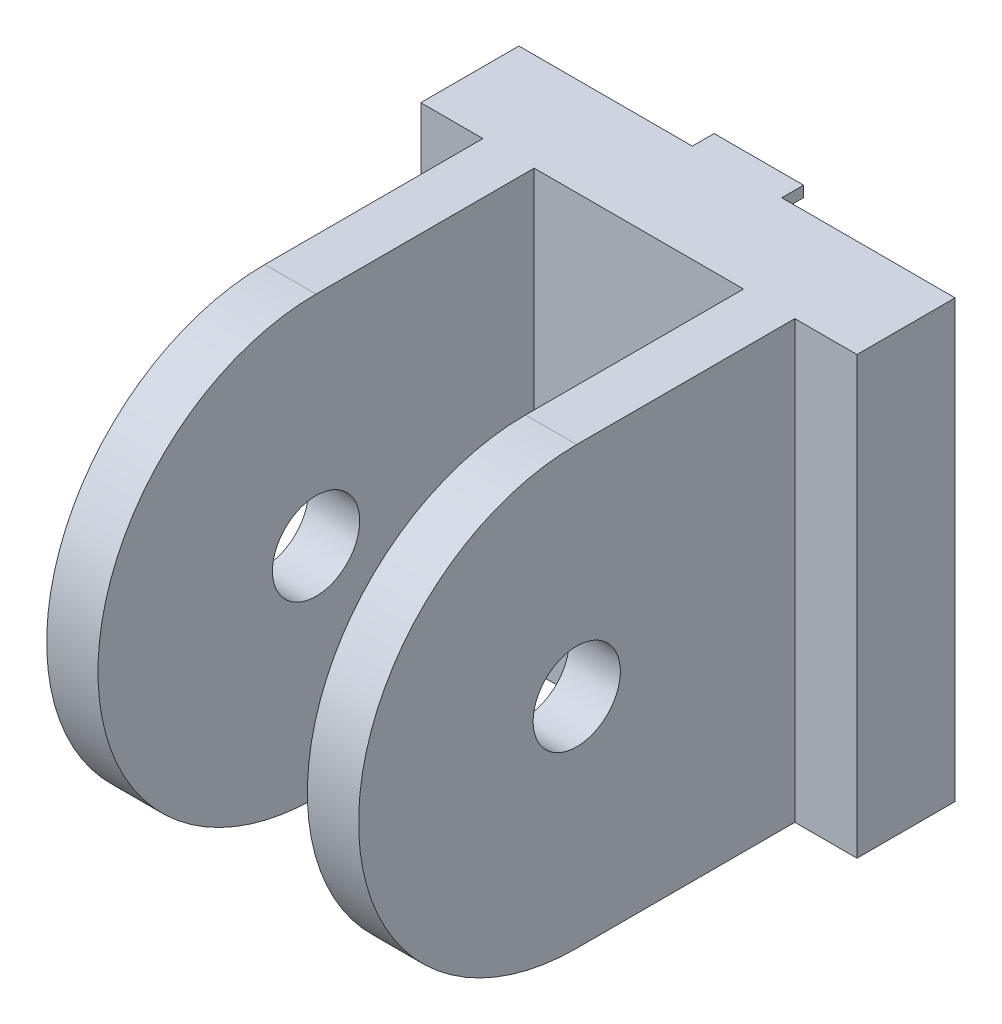
ISO-10303-21;
HEADER;
FILE_DESCRIPTION(('STEP AP214'),'2;1');
FILE_NAME('part.step','',(''),(''),'','','');
FILE_SCHEMA(('AUTOMOTIVE_DESIGN { 1 0 10303 214 1 1 1 1 }'));
ENDSEC;
DATA;
#1=APPLICATION_CONTEXT('core data for automotive mechanical design processes');
#2=APPLICATION_PROTOCOL_DEFINITION('international standard','automotive_design',2000,#1);
#3=PRODUCT_CONTEXT('',#1,'mechanical');
#4=PRODUCT('Part','Part','',(#3));
#5=PRODUCT_RELATED_PRODUCT_CATEGORY('part','',(#4));
#6=PRODUCT_DEFINITION_FORMATION('','',#4);
#7=PRODUCT_DEFINITION_CONTEXT('part definition',#1,'design');
#8=PRODUCT_DEFINITION('design','',#6,#7);
#9=PRODUCT_DEFINITION_SHAPE('','',#8);
#10=(LENGTH_UNIT() NAMED_UNIT(*) SI_UNIT(.MILLI.,.METRE.));
#11=(NAMED_UNIT(*) PLANE_ANGLE_UNIT() SI_UNIT($,.RADIAN.));
#12=(NAMED_UNIT(*) SI_UNIT($,.STERADIAN.) SOLID_ANGLE_UNIT());
#13=UNCERTAINTY_MEASURE_WITH_UNIT(LENGTH_MEASURE(1.E-05),#10,'distance_accuracy_value','');
#14=(GEOMETRIC_REPRESENTATION_CONTEXT(3) GLOBAL_UNCERTAINTY_ASSIGNED_CONTEXT((#13)) GLOBAL_UNIT_ASSIGNED_CONTEXT((#10,
#11,#12)) REPRESENTATION_CONTEXT('',''));
#15=CARTESIAN_POINT('',(0.,0.,0.));
#16=DIRECTION('',(0.,0.,1.));
#17=DIRECTION('',(1.,0.,0.));
#18=AXIS2_PLACEMENT_3D('',#15,#16,#17);
#19=CARTESIAN_POINT('',(20.,20.,0.));
#20=DIRECTION('',(0.,0.,-1.));
#21=DIRECTION('',(-1.,0.,0.));
#22=AXIS2_PLACEMENT_3D('',#19,#20,#21);
#23=PLANE('',#22);
#24=CARTESIAN_POINT('',(0.,0.,0.));
#25=DIRECTION('',(0.,0.,1.));
#26=DIRECTION('',(1.,0.,0.));
#27=AXIS2_PLACEMENT_3D('',#24,#25,#26);
#28=CIRCLE('',#27,4.);
#29=CARTESIAN_POINT('',(4.,0.,0.));
#30=VERTEX_POINT('',#29);
#31=EDGE_CURVE('E317',#30,#30,#28,.T.);
#32=ORIENTED_EDGE('',*,*,#31,.T.);
#33=EDGE_LOOP('',(#32));
#34=FACE_BOUND('',#33,.T.);
#35=DIRECTION('',(1.,0.,0.));
#36=VECTOR('',#35,1.);
#37=CARTESIAN_POINT('',(4.1,-19.,0.));
#38=LINE('',#37,#36);
#39=CARTESIAN_POINT('',(-4.1,-19.,0.));
#40=VERTEX_POINT('',#39);
#41=CARTESIAN_POINT('',(4.1,-19.,0.));
#42=VERTEX_POINT('',#41);
#43=EDGE_CURVE('E430',#40,#42,#38,.T.);
#44=ORIENTED_EDGE('',*,*,#43,.F.);
#45=DIRECTION('',(0.,1.,0.));
#46=VECTOR('',#45,1.);
#47=CARTESIAN_POINT('',(-4.1,-20.,0.));
#48=LINE('',#47,#46);
#49=CARTESIAN_POINT('',(-4.1,-20.,0.));
#50=VERTEX_POINT('',#49);
#51=EDGE_CURVE('E428',#50,#40,#48,.T.);
#52=ORIENTED_EDGE('',*,*,#51,.F.);
#53=DIRECTION('',(1.,0.,0.));
#54=VECTOR('',#53,1.);
#55=CARTESIAN_POINT('',(-20.,-20.,0.));
#56=LINE('',#55,#54);
#57=CARTESIAN_POINT('',(-20.,-20.,0.));
#58=VERTEX_POINT('',#57);
#59=EDGE_CURVE('E200',#58,#50,#56,.T.);
#60=ORIENTED_EDGE('',*,*,#59,.F.);
#61=DIRECTION('',(0.,-1.,0.));
#62=VECTOR('',#61,1.);
#63=CARTESIAN_POINT('',(-20.,-20.,0.));
#64=LINE('',#63,#62);
#65=CARTESIAN_POINT('',(-20.,20.,0.));
#66=VERTEX_POINT('',#65);
#67=EDGE_CURVE('E253',#66,#58,#64,.T.);
#68=ORIENTED_EDGE('',*,*,#67,.F.);
#69=DIRECTION('',(-1.,0.,0.));
#70=VECTOR('',#69,1.);
#71=CARTESIAN_POINT('',(-20.,20.,0.));
#72=LINE('',#71,#70);
#73=CARTESIAN_POINT('',(-4.1,20.,0.));
#74=VERTEX_POINT('',#73);
#75=EDGE_CURVE('E243',#74,#66,#72,.T.);
#76=ORIENTED_EDGE('',*,*,#75,.F.);
#77=DIRECTION('',(0.,1.,0.));
#78=VECTOR('',#77,1.);
#79=CARTESIAN_POINT('',(-4.1,20.,0.));
#80=LINE('',#79,#78);
#81=CARTESIAN_POINT('',(-4.1,19.,0.));
#82=VERTEX_POINT('',#81);
#83=EDGE_CURVE('E212',#82,#74,#80,.T.);
#84=ORIENTED_EDGE('',*,*,#83,.F.);
#85=DIRECTION('',(-1.,0.,0.));
#86=VECTOR('',#85,1.);
#87=CARTESIAN_POINT('',(4.1,19.,0.));
#88=LINE('',#87,#86);
#89=CARTESIAN_POINT('',(4.1,19.,0.));
#90=VERTEX_POINT('',#89);
#91=EDGE_CURVE('E60',#90,#82,#88,.T.);
#92=ORIENTED_EDGE('',*,*,#91,.F.);
#93=DIRECTION('',(0.,-1.,0.));
#94=VECTOR('',#93,1.);
#95=CARTESIAN_POINT('',(4.1,20.,0.));
#96=LINE('',#95,#94);
#97=CARTESIAN_POINT('',(4.1,20.,0.));
#98=VERTEX_POINT('',#97);
#99=EDGE_CURVE('E201',#98,#90,#96,.T.);
#100=ORIENTED_EDGE('',*,*,#99,.F.);
#101=CARTESIAN_POINT('',(20.,20.,0.));
#102=VERTEX_POINT('',#101);
#103=EDGE_CURVE('E246',#102,#98,#72,.T.);
#104=ORIENTED_EDGE('',*,*,#103,.F.);
#105=DIRECTION('',(0.,1.,0.));
#106=VECTOR('',#105,1.);
#107=CARTESIAN_POINT('',(20.,-20.,0.));
#108=LINE('',#107,#106);
#109=CARTESIAN_POINT('',(20.,-20.,0.));
#110=VERTEX_POINT('',#109);
#111=EDGE_CURVE('E247',#110,#102,#108,.T.);
#112=ORIENTED_EDGE('',*,*,#111,.F.);
#113=CARTESIAN_POINT('',(4.1,-20.,0.));
#114=VERTEX_POINT('',#113);
#115=EDGE_CURVE('E256',#114,#110,#56,.T.);
#116=ORIENTED_EDGE('',*,*,#115,.F.);
#117=DIRECTION('',(0.,-1.,0.));
#118=VECTOR('',#117,1.);
#119=CARTESIAN_POINT('',(4.1,-20.,0.));
#120=LINE('',#119,#118);
#121=EDGE_CURVE('E193',#42,#114,#120,.T.);
#122=ORIENTED_EDGE('',*,*,#121,.F.);
#123=EDGE_LOOP('',(#44,#52,#60,#68,#76,#84,#92,#100,#104,#112,#116,#122));
#124=FACE_BOUND('',#123,.T.);
#125=ADVANCED_FACE('F35',(#34,#124),#23,.T.);
#126=CARTESIAN_POINT('',(-20.,20.,9.));
#127=DIRECTION('',(0.,-1.,0.));
#128=DIRECTION('',(0.,0.,-1.));
#129=AXIS2_PLACEMENT_3D('',#126,#127,#128);
#130=PLANE('',#129);
#131=DIRECTION('',(1.,0.,0.));
#132=VECTOR('',#131,1.);
#133=CARTESIAN_POINT('',(-143.599890182419,20.,29.));
#134=LINE('',#133,#132);
#135=CARTESIAN_POINT('',(9.6,20.,29.));
#136=VERTEX_POINT('',#135);
#137=CARTESIAN_POINT('',(14.3,20.,29.));
#138=VERTEX_POINT('',#137);
#139=EDGE_CURVE('E329',#136,#138,#134,.T.);
#140=ORIENTED_EDGE('',*,*,#139,.T.);
#141=DIRECTION('',(0.,0.,-1.));
#142=VECTOR('',#141,1.);
#143=CARTESIAN_POINT('',(14.3,20.,49.));
#144=LINE('',#143,#142);
#145=CARTESIAN_POINT('',(14.3,20.,9.));
#146=VERTEX_POINT('',#145);
#147=EDGE_CURVE('E356',#138,#146,#144,.T.);
#148=ORIENTED_EDGE('',*,*,#147,.T.);
#149=DIRECTION('',(-1.,0.,0.));
#150=VECTOR('',#149,1.);
#151=CARTESIAN_POINT('',(-20.,20.,9.));
#152=LINE('',#151,#150);
#153=CARTESIAN_POINT('',(20.,20.,9.));
#154=VERTEX_POINT('',#153);
#155=EDGE_CURVE('E267',#154,#146,#152,.T.);
#156=ORIENTED_EDGE('',*,*,#155,.F.);
#157=DIRECTION('',(0.,0.,-1.));
#158=VECTOR('',#157,1.);
#159=CARTESIAN_POINT('',(20.,20.,9.));
#160=LINE('',#159,#158);
#161=EDGE_CURVE('E11',#154,#102,#160,.T.);
#162=ORIENTED_EDGE('',*,*,#161,.T.);
#163=ORIENTED_EDGE('',*,*,#103,.T.);
#164=DIRECTION('',(0.,0.,1.));
#165=VECTOR('',#164,1.);
#166=CARTESIAN_POINT('',(4.1,20.,-2.));
#167=LINE('',#166,#165);
#168=CARTESIAN_POINT('',(4.1,20.,-2.));
#169=VERTEX_POINT('',#168);
#170=EDGE_CURVE('E218',#169,#98,#167,.T.);
#171=ORIENTED_EDGE('',*,*,#170,.F.);
#172=DIRECTION('',(1.,0.,0.));
#173=VECTOR('',#172,1.);
#174=CARTESIAN_POINT('',(4.1,20.,-2.));
#175=LINE('',#174,#173);
#176=CARTESIAN_POINT('',(-4.1,20.,-2.));
#177=VERTEX_POINT('',#176);
#178=EDGE_CURVE('E216',#177,#169,#175,.T.);
#179=ORIENTED_EDGE('',*,*,#178,.F.);
#180=DIRECTION('',(0.,0.,1.));
#181=VECTOR('',#180,1.);
#182=CARTESIAN_POINT('',(-4.1,20.,-2.));
#183=LINE('',#182,#181);
#184=EDGE_CURVE('E229',#177,#74,#183,.T.);
#185=ORIENTED_EDGE('',*,*,#184,.T.);
#186=ORIENTED_EDGE('',*,*,#75,.T.);
#187=DIRECTION('',(0.,0.,-1.));
#188=VECTOR('',#187,1.);
#189=CARTESIAN_POINT('',(-20.,20.,9.));
#190=LINE('',#189,#188);
#191=CARTESIAN_POINT('',(-20.,20.,9.));
#192=VERTEX_POINT('',#191);
#193=EDGE_CURVE('E44',#192,#66,#190,.T.);
#194=ORIENTED_EDGE('',*,*,#193,.F.);
#195=CARTESIAN_POINT('',(-14.3,20.,9.));
#196=VERTEX_POINT('',#195);
#197=EDGE_CURVE('E273',#196,#192,#152,.T.);
#198=ORIENTED_EDGE('',*,*,#197,.F.);
#199=DIRECTION('',(0.,0.,-1.));
#200=VECTOR('',#199,1.);
#201=CARTESIAN_POINT('',(-14.3,20.,49.));
#202=LINE('',#201,#200);
#203=CARTESIAN_POINT('',(-14.3,20.,29.));
#204=VERTEX_POINT('',#203);
#205=EDGE_CURVE('E290',#204,#196,#202,.T.);
#206=ORIENTED_EDGE('',*,*,#205,.F.);
#207=CARTESIAN_POINT('',(-9.6,20.,29.));
#208=VERTEX_POINT('',#207);
#209=EDGE_CURVE('E332',#204,#208,#134,.T.);
#210=ORIENTED_EDGE('',*,*,#209,.T.);
#211=DIRECTION('',(0.,0.,-1.));
#212=VECTOR('',#211,1.);
#213=CARTESIAN_POINT('',(-9.59999999999999,20.,49.));
#214=LINE('',#213,#212);
#215=CARTESIAN_POINT('',(-9.59999999999999,20.,9.));
#216=VERTEX_POINT('',#215);
#217=EDGE_CURVE('E304',#208,#216,#214,.T.);
#218=ORIENTED_EDGE('',*,*,#217,.T.);
#219=CARTESIAN_POINT('',(9.59999999999999,20.,9.));
#220=VERTEX_POINT('',#219);
#221=EDGE_CURVE('E272',#220,#216,#152,.T.);
#222=ORIENTED_EDGE('',*,*,#221,.F.);
#223=DIRECTION('',(0.,0.,-1.));
#224=VECTOR('',#223,1.);
#225=CARTESIAN_POINT('',(9.59999999999999,20.,49.));
#226=LINE('',#225,#224);
#227=EDGE_CURVE('E354',#136,#220,#226,.T.);
#228=ORIENTED_EDGE('',*,*,#227,.F.);
#229=EDGE_LOOP('',(#140,#148,#156,#162,#163,#171,#179,#185,#186,#194,#198,#206,#210,#218,#222,#228));
#230=FACE_BOUND('',#229,.T.);
#231=ADVANCED_FACE('F376',(#230),#130,.F.);
#232=CARTESIAN_POINT('',(20.,20.,9.));
#233=DIRECTION('',(0.,0.,-1.));
#234=DIRECTION('',(-1.,0.,0.));
#235=AXIS2_PLACEMENT_3D('',#232,#233,#234);
#236=PLANE('',#235);
#237=DIRECTION('',(0.,1.,0.));
#238=VECTOR('',#237,1.);
#239=CARTESIAN_POINT('',(14.3,-20.,9.));
#240=LINE('',#239,#238);
#241=CARTESIAN_POINT('',(14.3,-20.,9.));
#242=VERTEX_POINT('',#241);
#243=EDGE_CURVE('E343',#242,#146,#240,.T.);
#244=ORIENTED_EDGE('',*,*,#243,.F.);
#245=DIRECTION('',(1.,0.,0.));
#246=VECTOR('',#245,1.);
#247=CARTESIAN_POINT('',(-20.,-20.,9.));
#248=LINE('',#247,#246);
#249=CARTESIAN_POINT('',(20.,-20.,9.));
#250=VERTEX_POINT('',#249);
#251=EDGE_CURVE('E285',#242,#250,#248,.T.);
#252=ORIENTED_EDGE('',*,*,#251,.T.);
#253=DIRECTION('',(0.,1.,0.));
#254=VECTOR('',#253,1.);
#255=CARTESIAN_POINT('',(20.,-20.,9.));
#256=LINE('',#255,#254);
#257=EDGE_CURVE('E258',#250,#154,#256,.T.);
#258=ORIENTED_EDGE('',*,*,#257,.T.);
#259=ORIENTED_EDGE('',*,*,#155,.T.);
#260=EDGE_LOOP('',(#244,#252,#258,#259));
#261=FACE_BOUND('',#260,.T.);
#262=ADVANCED_FACE('F384',(#261),#236,.F.);
#263=CARTESIAN_POINT('',(0.,0.,9.));
#264=DIRECTION('',(0.,0.,1.));
#265=DIRECTION('',(1.,0.,0.));
#266=AXIS2_PLACEMENT_3D('',#263,#264,#265);
#267=CIRCLE('',#266,4.);
#268=CARTESIAN_POINT('',(4.,0.,9.));
#269=VERTEX_POINT('',#268);
#270=EDGE_CURVE('E322',#269,#269,#267,.T.);
#271=ORIENTED_EDGE('',*,*,#270,.F.);
#272=EDGE_LOOP('',(#271));
#273=FACE_BOUND('',#272,.T.);
#274=DIRECTION('',(0.,-1.,0.));
#275=VECTOR('',#274,1.);
#276=CARTESIAN_POINT('',(9.59999999999999,-20.,9.));
#277=LINE('',#276,#275);
#278=CARTESIAN_POINT('',(9.59999999999999,-20.,9.));
#279=VERTEX_POINT('',#278);
#280=EDGE_CURVE('E347',#220,#279,#277,.T.);
#281=ORIENTED_EDGE('',*,*,#280,.F.);
#282=ORIENTED_EDGE('',*,*,#221,.T.);
#283=DIRECTION('',(0.,1.,0.));
#284=VECTOR('',#283,1.);
#285=CARTESIAN_POINT('',(-9.59999999999999,-20.,9.));
#286=LINE('',#285,#284);
#287=CARTESIAN_POINT('',(-9.59999999999999,-20.,9.));
#288=VERTEX_POINT('',#287);
#289=EDGE_CURVE('E302',#288,#216,#286,.T.);
#290=ORIENTED_EDGE('',*,*,#289,.F.);
#291=EDGE_CURVE('E409',#288,#279,#248,.T.);
#292=ORIENTED_EDGE('',*,*,#291,.T.);
#293=EDGE_LOOP('',(#281,#282,#290,#292));
#294=FACE_BOUND('',#293,.T.);
#295=ADVANCED_FACE('F401',(#273,#294),#236,.F.);
#296=DIRECTION('',(0.,-1.,0.));
#297=VECTOR('',#296,1.);
#298=CARTESIAN_POINT('',(-14.3,-20.,9.));
#299=LINE('',#298,#297);
#300=CARTESIAN_POINT('',(-14.3,-20.,9.));
#301=VERTEX_POINT('',#300);
#302=EDGE_CURVE('E296',#196,#301,#299,.T.);
#303=ORIENTED_EDGE('',*,*,#302,.F.);
#304=ORIENTED_EDGE('',*,*,#197,.T.);
#305=DIRECTION('',(0.,-1.,0.));
#306=VECTOR('',#305,1.);
#307=CARTESIAN_POINT('',(-20.,-20.,9.));
#308=LINE('',#307,#306);
#309=CARTESIAN_POINT('',(-20.,-20.,9.));
#310=VERTEX_POINT('',#309);
#311=EDGE_CURVE('E271',#192,#310,#308,.T.);
#312=ORIENTED_EDGE('',*,*,#311,.T.);
#313=EDGE_CURVE('E263',#310,#301,#248,.T.);
#314=ORIENTED_EDGE('',*,*,#313,.T.);
#315=EDGE_LOOP('',(#303,#304,#312,#314));
#316=FACE_BOUND('',#315,.T.);
#317=ADVANCED_FACE('F373',(#316),#236,.F.);
#318=CARTESIAN_POINT('',(20.,-20.,9.));
#319=DIRECTION('',(-1.,0.,0.));
#320=DIRECTION('',(0.,0.,1.));
#321=AXIS2_PLACEMENT_3D('',#318,#319,#320);
#322=PLANE('',#321);
#323=ORIENTED_EDGE('',*,*,#111,.T.);
#324=ORIENTED_EDGE('',*,*,#161,.F.);
#325=ORIENTED_EDGE('',*,*,#257,.F.);
#326=DIRECTION('',(0.,0.,-1.));
#327=VECTOR('',#326,1.);
#328=CARTESIAN_POINT('',(20.,-20.,9.));
#329=LINE('',#328,#327);
#330=EDGE_CURVE('E259',#250,#110,#329,.T.);
#331=ORIENTED_EDGE('',*,*,#330,.T.);
#332=EDGE_LOOP('',(#323,#324,#325,#331));
#333=FACE_BOUND('',#332,.T.);
#334=ADVANCED_FACE('F37',(#333),#322,.F.);
#335=CARTESIAN_POINT('',(-20.,-20.,9.));
#336=DIRECTION('',(1.,0.,0.));
#337=DIRECTION('',(0.,0.,-1.));
#338=AXIS2_PLACEMENT_3D('',#335,#336,#337);
#339=PLANE('',#338);
#340=ORIENTED_EDGE('',*,*,#67,.T.);
#341=DIRECTION('',(0.,0.,-1.));
#342=VECTOR('',#341,1.);
#343=CARTESIAN_POINT('',(-20.,-20.,9.));
#344=LINE('',#343,#342);
#345=EDGE_CURVE('E262',#310,#58,#344,.T.);
#346=ORIENTED_EDGE('',*,*,#345,.F.);
#347=ORIENTED_EDGE('',*,*,#311,.F.);
#348=ORIENTED_EDGE('',*,*,#193,.T.);
#349=EDGE_LOOP('',(#340,#346,#347,#348));
#350=FACE_BOUND('',#349,.T.);
#351=ADVANCED_FACE('F426',(#350),#339,.F.);
#352=CARTESIAN_POINT('',(-20.,-20.,9.));
#353=DIRECTION('',(0.,1.,0.));
#354=DIRECTION('',(0.,0.,1.));
#355=AXIS2_PLACEMENT_3D('',#352,#353,#354);
#356=PLANE('',#355);
#357=DIRECTION('',(0.,0.,-1.));
#358=VECTOR('',#357,1.);
#359=CARTESIAN_POINT('',(14.3,-20.,49.));
#360=LINE('',#359,#358);
#361=CARTESIAN_POINT('',(14.3,-20.,29.));
#362=VERTEX_POINT('',#361);
#363=EDGE_CURVE('E350',#362,#242,#360,.T.);
#364=ORIENTED_EDGE('',*,*,#363,.F.);
#365=DIRECTION('',(1.,0.,0.));
#366=VECTOR('',#365,1.);
#367=CARTESIAN_POINT('',(-143.599890182419,-20.,29.));
#368=LINE('',#367,#366);
#369=CARTESIAN_POINT('',(9.6,-20.,29.));
#370=VERTEX_POINT('',#369);
#371=EDGE_CURVE('E328',#370,#362,#368,.T.);
#372=ORIENTED_EDGE('',*,*,#371,.F.);
#373=DIRECTION('',(0.,0.,-1.));
#374=VECTOR('',#373,1.);
#375=CARTESIAN_POINT('',(9.59999999999999,-20.,49.));
#376=LINE('',#375,#374);
#377=EDGE_CURVE('E352',#370,#279,#376,.T.);
#378=ORIENTED_EDGE('',*,*,#377,.T.);
#379=ORIENTED_EDGE('',*,*,#291,.F.);
#380=DIRECTION('',(0.,0.,-1.));
#381=VECTOR('',#380,1.);
#382=CARTESIAN_POINT('',(-9.59999999999999,-20.,49.));
#383=LINE('',#382,#381);
#384=CARTESIAN_POINT('',(-9.6,-20.,29.));
#385=VERTEX_POINT('',#384);
#386=EDGE_CURVE('E291',#385,#288,#383,.T.);
#387=ORIENTED_EDGE('',*,*,#386,.F.);
#388=CARTESIAN_POINT('',(-14.3,-20.,29.));
#389=VERTEX_POINT('',#388);
#390=EDGE_CURVE('E333',#389,#385,#368,.T.);
#391=ORIENTED_EDGE('',*,*,#390,.F.);
#392=DIRECTION('',(0.,0.,-1.));
#393=VECTOR('',#392,1.);
#394=CARTESIAN_POINT('',(-14.3,-20.,49.));
#395=LINE('',#394,#393);
#396=EDGE_CURVE('E287',#389,#301,#395,.T.);
#397=ORIENTED_EDGE('',*,*,#396,.T.);
#398=ORIENTED_EDGE('',*,*,#313,.F.);
#399=ORIENTED_EDGE('',*,*,#345,.T.);
#400=ORIENTED_EDGE('',*,*,#59,.T.);
#401=DIRECTION('',(0.,0.,1.));
#402=VECTOR('',#401,1.);
#403=CARTESIAN_POINT('',(-4.1,-20.,-2.));
#404=LINE('',#403,#402);
#405=CARTESIAN_POINT('',(-4.1,-20.,-2.));
#406=VERTEX_POINT('',#405);
#407=EDGE_CURVE('E178',#406,#50,#404,.T.);
#408=ORIENTED_EDGE('',*,*,#407,.F.);
#409=DIRECTION('',(-1.,0.,0.));
#410=VECTOR('',#409,1.);
#411=CARTESIAN_POINT('',(4.1,-20.,-2.));
#412=LINE('',#411,#410);
#413=CARTESIAN_POINT('',(4.1,-20.,-2.));
#414=VERTEX_POINT('',#413);
#415=EDGE_CURVE('E185',#414,#406,#412,.T.);
#416=ORIENTED_EDGE('',*,*,#415,.F.);
#417=DIRECTION('',(0.,0.,1.));
#418=VECTOR('',#417,1.);
#419=CARTESIAN_POINT('',(4.1,-20.,-2.));
#420=LINE('',#419,#418);
#421=EDGE_CURVE('E437',#414,#114,#420,.T.);
#422=ORIENTED_EDGE('',*,*,#421,.T.);
#423=ORIENTED_EDGE('',*,*,#115,.T.);
#424=ORIENTED_EDGE('',*,*,#330,.F.);
#425=ORIENTED_EDGE('',*,*,#251,.F.);
#426=EDGE_LOOP('',(#364,#372,#378,#379,#387,#391,#397,#398,#399,#400,#408,#416,#422,#423,#424,#425));
#427=FACE_BOUND('',#426,.T.);
#428=ADVANCED_FACE('F197',(#427),#356,.F.);
#429=CARTESIAN_POINT('',(-9.59999999999999,-20.,49.));
#430=DIRECTION('',(-1.,0.,0.));
#431=DIRECTION('',(0.,0.,1.));
#432=AXIS2_PLACEMENT_3D('',#429,#430,#431);
#433=PLANE('',#432);
#434=CARTESIAN_POINT('',(-9.59999999999999,0.,29.));
#435=DIRECTION('',(-1.,0.,0.));
#436=DIRECTION('',(0.,0.,1.));
#437=AXIS2_PLACEMENT_3D('',#434,#435,#436);
#438=CIRCLE('',#437,4.);
#439=CARTESIAN_POINT('',(-9.59999999999999,0.,33.));
#440=VERTEX_POINT('',#439);
#441=EDGE_CURVE('E314',#440,#440,#438,.T.);
#442=ORIENTED_EDGE('',*,*,#441,.T.);
#443=EDGE_LOOP('',(#442));
#444=FACE_BOUND('',#443,.T.);
#445=CARTESIAN_POINT('',(-9.6,0.,29.));
#446=DIRECTION('',(-1.,0.,0.));
#447=DIRECTION('',(0.,0.,1.));
#448=AXIS2_PLACEMENT_3D('',#445,#446,#447);
#449=CIRCLE('',#448,20.);
#450=EDGE_CURVE('E338',#208,#385,#449,.F.);
#451=ORIENTED_EDGE('',*,*,#450,.T.);
#452=ORIENTED_EDGE('',*,*,#386,.T.);
#453=ORIENTED_EDGE('',*,*,#289,.T.);
#454=ORIENTED_EDGE('',*,*,#217,.F.);
#455=EDGE_LOOP('',(#451,#452,#453,#454));
#456=FACE_BOUND('',#455,.T.);
#457=ADVANCED_FACE('F414',(#444,#456),#433,.F.);
#458=CARTESIAN_POINT('',(-14.3,-20.,49.));
#459=DIRECTION('',(1.,0.,0.));
#460=DIRECTION('',(0.,0.,-1.));
#461=AXIS2_PLACEMENT_3D('',#458,#459,#460);
#462=PLANE('',#461);
#463=CARTESIAN_POINT('',(-14.3,0.,29.));
#464=DIRECTION('',(-1.,0.,0.));
#465=DIRECTION('',(0.,0.,1.));
#466=AXIS2_PLACEMENT_3D('',#463,#464,#465);
#467=CIRCLE('',#466,4.);
#468=CARTESIAN_POINT('',(-14.3,0.,33.));
#469=VERTEX_POINT('',#468);
#470=EDGE_CURVE('E310',#469,#469,#467,.T.);
#471=ORIENTED_EDGE('',*,*,#470,.F.);
#472=EDGE_LOOP('',(#471));
#473=FACE_BOUND('',#472,.T.);
#474=ORIENTED_EDGE('',*,*,#396,.F.);
#475=CARTESIAN_POINT('',(-14.3,0.,29.));
#476=DIRECTION('',(1.,0.,0.));
#477=DIRECTION('',(0.,0.,-1.));
#478=AXIS2_PLACEMENT_3D('',#475,#476,#477);
#479=CIRCLE('',#478,20.);
#480=EDGE_CURVE('E341',#389,#204,#479,.F.);
#481=ORIENTED_EDGE('',*,*,#480,.T.);
#482=ORIENTED_EDGE('',*,*,#205,.T.);
#483=ORIENTED_EDGE('',*,*,#302,.T.);
#484=EDGE_LOOP('',(#474,#481,#482,#483));
#485=FACE_BOUND('',#484,.T.);
#486=ADVANCED_FACE('F368',(#473,#485),#462,.F.);
#487=CARTESIAN_POINT('',(14.3,-20.,49.));
#488=DIRECTION('',(-1.,0.,0.));
#489=DIRECTION('',(0.,0.,1.));
#490=AXIS2_PLACEMENT_3D('',#487,#488,#489);
#491=PLANE('',#490);
#492=CARTESIAN_POINT('',(14.3,0.,29.));
#493=DIRECTION('',(-1.,0.,0.));
#494=DIRECTION('',(0.,0.,1.));
#495=AXIS2_PLACEMENT_3D('',#492,#493,#494);
#496=CIRCLE('',#495,4.);
#497=CARTESIAN_POINT('',(14.3,0.,33.));
#498=VERTEX_POINT('',#497);
#499=EDGE_CURVE('E309',#498,#498,#496,.T.);
#500=ORIENTED_EDGE('',*,*,#499,.T.);
#501=EDGE_LOOP('',(#500));
#502=FACE_BOUND('',#501,.T.);
#503=CARTESIAN_POINT('',(14.3,0.,29.));
#504=DIRECTION('',(-1.,0.,0.));
#505=DIRECTION('',(0.,0.,1.));
#506=AXIS2_PLACEMENT_3D('',#503,#504,#505);
#507=CIRCLE('',#506,20.);
#508=EDGE_CURVE('E339',#138,#362,#507,.F.);
#509=ORIENTED_EDGE('',*,*,#508,.T.);
#510=ORIENTED_EDGE('',*,*,#363,.T.);
#511=ORIENTED_EDGE('',*,*,#243,.T.);
#512=ORIENTED_EDGE('',*,*,#147,.F.);
#513=EDGE_LOOP('',(#509,#510,#511,#512));
#514=FACE_BOUND('',#513,.T.);
#515=ADVANCED_FACE('F442',(#502,#514),#491,.F.);
#516=CARTESIAN_POINT('',(9.59999999999999,-20.,49.));
#517=DIRECTION('',(1.,0.,0.));
#518=DIRECTION('',(0.,0.,-1.));
#519=AXIS2_PLACEMENT_3D('',#516,#517,#518);
#520=PLANE('',#519);
#521=CARTESIAN_POINT('',(9.59999999999999,0.,29.));
#522=DIRECTION('',(1.,0.,0.));
#523=DIRECTION('',(0.,0.,-1.));
#524=AXIS2_PLACEMENT_3D('',#521,#522,#523);
#525=CIRCLE('',#524,4.);
#526=CARTESIAN_POINT('',(9.59999999999999,0.,25.));
#527=VERTEX_POINT('',#526);
#528=EDGE_CURVE('E306',#527,#527,#525,.T.);
#529=ORIENTED_EDGE('',*,*,#528,.T.);
#530=EDGE_LOOP('',(#529));
#531=FACE_BOUND('',#530,.T.);
#532=ORIENTED_EDGE('',*,*,#377,.F.);
#533=CARTESIAN_POINT('',(9.6,0.,29.));
#534=DIRECTION('',(1.,0.,0.));
#535=DIRECTION('',(0.,0.,-1.));
#536=AXIS2_PLACEMENT_3D('',#533,#534,#535);
#537=CIRCLE('',#536,20.);
#538=EDGE_CURVE('E336',#370,#136,#537,.F.);
#539=ORIENTED_EDGE('',*,*,#538,.T.);
#540=ORIENTED_EDGE('',*,*,#227,.T.);
#541=ORIENTED_EDGE('',*,*,#280,.T.);
#542=EDGE_LOOP('',(#532,#539,#540,#541));
#543=FACE_BOUND('',#542,.T.);
#544=ADVANCED_FACE('F446',(#531,#543),#520,.F.);
#545=CARTESIAN_POINT('',(-143.599890182419,0.,29.));
#546=DIRECTION('',(1.,0.,0.));
#547=DIRECTION('',(0.,0.,-1.));
#548=AXIS2_PLACEMENT_3D('',#545,#546,#547);
#549=CYLINDRICAL_SURFACE('',#548,20.);
#550=ORIENTED_EDGE('',*,*,#371,.T.);
#551=ORIENTED_EDGE('',*,*,#508,.F.);
#552=ORIENTED_EDGE('',*,*,#139,.F.);
#553=ORIENTED_EDGE('',*,*,#538,.F.);
#554=EDGE_LOOP('',(#550,#551,#552,#553));
#555=FACE_BOUND('',#554,.T.);
#556=ADVANCED_FACE('F445',(#555),#549,.T.);
#557=ORIENTED_EDGE('',*,*,#390,.T.);
#558=ORIENTED_EDGE('',*,*,#450,.F.);
#559=ORIENTED_EDGE('',*,*,#209,.F.);
#560=ORIENTED_EDGE('',*,*,#480,.F.);
#561=EDGE_LOOP('',(#557,#558,#559,#560));
#562=FACE_BOUND('',#561,.T.);
#563=ADVANCED_FACE('F419',(#562),#549,.T.);
#564=CARTESIAN_POINT('',(20.,0.,29.));
#565=DIRECTION('',(-1.,0.,0.));
#566=DIRECTION('',(0.,0.,1.));
#567=AXIS2_PLACEMENT_3D('',#564,#565,#566);
#568=CYLINDRICAL_SURFACE('',#567,4.);
#569=ORIENTED_EDGE('',*,*,#528,.F.);
#570=EDGE_LOOP('',(#569));
#571=FACE_BOUND('',#570,.T.);
#572=ORIENTED_EDGE('',*,*,#499,.F.);
#573=EDGE_LOOP('',(#572));
#574=FACE_BOUND('',#573,.T.);
#575=ADVANCED_FACE('F591',(#571,#574),#568,.F.);
#576=ORIENTED_EDGE('',*,*,#470,.T.);
#577=EDGE_LOOP('',(#576));
#578=FACE_BOUND('',#577,.T.);
#579=ORIENTED_EDGE('',*,*,#441,.F.);
#580=EDGE_LOOP('',(#579));
#581=FACE_BOUND('',#580,.T.);
#582=ADVANCED_FACE('F491',(#578,#581),#568,.F.);
#583=CARTESIAN_POINT('',(0.,0.,0.));
#584=DIRECTION('',(0.,0.,1.));
#585=DIRECTION('',(1.,0.,0.));
#586=AXIS2_PLACEMENT_3D('',#583,#584,#585);
#587=CYLINDRICAL_SURFACE('',#586,4.);
#588=ORIENTED_EDGE('',*,*,#31,.F.);
#589=EDGE_LOOP('',(#588));
#590=FACE_BOUND('',#589,.T.);
#591=ORIENTED_EDGE('',*,*,#270,.T.);
#592=EDGE_LOOP('',(#591));
#593=FACE_BOUND('',#592,.T.);
#594=ADVANCED_FACE('F399',(#590,#593),#587,.F.);
#595=CARTESIAN_POINT('',(4.1,20.,-2.));
#596=DIRECTION('',(-1.,0.,0.));
#597=DIRECTION('',(0.,-1.,0.));
#598=AXIS2_PLACEMENT_3D('',#595,#596,#597);
#599=PLANE('',#598);
#600=ORIENTED_EDGE('',*,*,#99,.T.);
#601=DIRECTION('',(0.,0.,1.));
#602=VECTOR('',#601,1.);
#603=CARTESIAN_POINT('',(4.1,19.,-2.));
#604=LINE('',#603,#602);
#605=CARTESIAN_POINT('',(4.1,19.,-2.));
#606=VERTEX_POINT('',#605);
#607=EDGE_CURVE('E235',#606,#90,#604,.T.);
#608=ORIENTED_EDGE('',*,*,#607,.F.);
#609=DIRECTION('',(0.,-1.,0.));
#610=VECTOR('',#609,1.);
#611=CARTESIAN_POINT('',(4.1,20.,-2.));
#612=LINE('',#611,#610);
#613=EDGE_CURVE('E208',#169,#606,#612,.T.);
#614=ORIENTED_EDGE('',*,*,#613,.F.);
#615=ORIENTED_EDGE('',*,*,#170,.T.);
#616=EDGE_LOOP('',(#600,#608,#614,#615));
#617=FACE_BOUND('',#616,.T.);
#618=ADVANCED_FACE('F394',(#617),#599,.F.);
#619=CARTESIAN_POINT('',(4.1,19.,-2.));
#620=DIRECTION('',(0.,1.,0.));
#621=DIRECTION('',(0.,0.,1.));
#622=AXIS2_PLACEMENT_3D('',#619,#620,#621);
#623=PLANE('',#622);
#624=ORIENTED_EDGE('',*,*,#91,.T.);
#625=DIRECTION('',(0.,0.,1.));
#626=VECTOR('',#625,1.);
#627=CARTESIAN_POINT('',(-4.1,19.,-2.));
#628=LINE('',#627,#626);
#629=CARTESIAN_POINT('',(-4.1,19.,-2.));
#630=VERTEX_POINT('',#629);
#631=EDGE_CURVE('E222',#630,#82,#628,.T.);
#632=ORIENTED_EDGE('',*,*,#631,.F.);
#633=DIRECTION('',(-1.,0.,0.));
#634=VECTOR('',#633,1.);
#635=CARTESIAN_POINT('',(4.1,19.,-2.));
#636=LINE('',#635,#634);
#637=EDGE_CURVE('E211',#606,#630,#636,.T.);
#638=ORIENTED_EDGE('',*,*,#637,.F.);
#639=ORIENTED_EDGE('',*,*,#607,.T.);
#640=EDGE_LOOP('',(#624,#632,#638,#639));
#641=FACE_BOUND('',#640,.T.);
#642=ADVANCED_FACE('F526',(#641),#623,.F.);
#643=CARTESIAN_POINT('',(-4.1,20.,-2.));
#644=DIRECTION('',(1.,0.,0.));
#645=DIRECTION('',(0.,1.,0.));
#646=AXIS2_PLACEMENT_3D('',#643,#644,#645);
#647=PLANE('',#646);
#648=ORIENTED_EDGE('',*,*,#83,.T.);
#649=ORIENTED_EDGE('',*,*,#184,.F.);
#650=DIRECTION('',(0.,1.,0.));
#651=VECTOR('',#650,1.);
#652=CARTESIAN_POINT('',(-4.1,20.,-2.));
#653=LINE('',#652,#651);
#654=EDGE_CURVE('E214',#630,#177,#653,.T.);
#655=ORIENTED_EDGE('',*,*,#654,.F.);
#656=ORIENTED_EDGE('',*,*,#631,.T.);
#657=EDGE_LOOP('',(#648,#649,#655,#656));
#658=FACE_BOUND('',#657,.T.);
#659=ADVANCED_FACE('F535',(#658),#647,.F.);
#660=CARTESIAN_POINT('',(4.1,19.,-2.));
#661=DIRECTION('',(0.,0.,-1.));
#662=DIRECTION('',(-1.,0.,0.));
#663=AXIS2_PLACEMENT_3D('',#660,#661,#662);
#664=PLANE('',#663);
#665=ORIENTED_EDGE('',*,*,#613,.T.);
#666=ORIENTED_EDGE('',*,*,#637,.T.);
#667=ORIENTED_EDGE('',*,*,#654,.T.);
#668=ORIENTED_EDGE('',*,*,#178,.T.);
#669=EDGE_LOOP('',(#665,#666,#667,#668));
#670=FACE_BOUND('',#669,.T.);
#671=ADVANCED_FACE('F544',(#670),#664,.T.);
#672=CARTESIAN_POINT('',(-4.1,-20.,-2.));
#673=DIRECTION('',(1.,0.,0.));
#674=DIRECTION('',(0.,1.,0.));
#675=AXIS2_PLACEMENT_3D('',#672,#673,#674);
#676=PLANE('',#675);
#677=ORIENTED_EDGE('',*,*,#51,.T.);
#678=DIRECTION('',(0.,0.,1.));
#679=VECTOR('',#678,1.);
#680=CARTESIAN_POINT('',(-4.1,-19.,-2.));
#681=LINE('',#680,#679);
#682=CARTESIAN_POINT('',(-4.1,-19.,-2.));
#683=VERTEX_POINT('',#682);
#684=EDGE_CURVE('E181',#683,#40,#681,.T.);
#685=ORIENTED_EDGE('',*,*,#684,.F.);
#686=DIRECTION('',(0.,1.,0.));
#687=VECTOR('',#686,1.);
#688=CARTESIAN_POINT('',(-4.1,-20.,-2.));
#689=LINE('',#688,#687);
#690=EDGE_CURVE('E174',#406,#683,#689,.T.);
#691=ORIENTED_EDGE('',*,*,#690,.F.);
#692=ORIENTED_EDGE('',*,*,#407,.T.);
#693=EDGE_LOOP('',(#677,#685,#691,#692));
#694=FACE_BOUND('',#693,.T.);
#695=ADVANCED_FACE('F176',(#694),#676,.F.);
#696=CARTESIAN_POINT('',(4.1,-19.,-2.));
#697=DIRECTION('',(0.,-1.,0.));
#698=DIRECTION('',(0.,0.,-1.));
#699=AXIS2_PLACEMENT_3D('',#696,#697,#698);
#700=PLANE('',#699);
#701=ORIENTED_EDGE('',*,*,#43,.T.);
#702=DIRECTION('',(0.,0.,1.));
#703=VECTOR('',#702,1.);
#704=CARTESIAN_POINT('',(4.1,-19.,-2.));
#705=LINE('',#704,#703);
#706=CARTESIAN_POINT('',(4.1,-19.,-2.));
#707=VERTEX_POINT('',#706);
#708=EDGE_CURVE('E52',#707,#42,#705,.T.);
#709=ORIENTED_EDGE('',*,*,#708,.F.);
#710=DIRECTION('',(1.,0.,0.));
#711=VECTOR('',#710,1.);
#712=CARTESIAN_POINT('',(4.1,-19.,-2.));
#713=LINE('',#712,#711);
#714=EDGE_CURVE('E184',#683,#707,#713,.T.);
#715=ORIENTED_EDGE('',*,*,#714,.F.);
#716=ORIENTED_EDGE('',*,*,#684,.T.);
#717=EDGE_LOOP('',(#701,#709,#715,#716));
#718=FACE_BOUND('',#717,.T.);
#719=ADVANCED_FACE('F439',(#718),#700,.F.);
#720=CARTESIAN_POINT('',(4.1,-20.,-2.));
#721=DIRECTION('',(-1.,0.,0.));
#722=DIRECTION('',(0.,-1.,0.));
#723=AXIS2_PLACEMENT_3D('',#720,#721,#722);
#724=PLANE('',#723);
#725=ORIENTED_EDGE('',*,*,#121,.T.);
#726=ORIENTED_EDGE('',*,*,#421,.F.);
#727=DIRECTION('',(0.,-1.,0.));
#728=VECTOR('',#727,1.);
#729=CARTESIAN_POINT('',(4.1,-20.,-2.));
#730=LINE('',#729,#728);
#731=EDGE_CURVE('E189',#707,#414,#730,.T.);
#732=ORIENTED_EDGE('',*,*,#731,.F.);
#733=ORIENTED_EDGE('',*,*,#708,.T.);
#734=EDGE_LOOP('',(#725,#726,#732,#733));
#735=FACE_BOUND('',#734,.T.);
#736=ADVANCED_FACE('F440',(#735),#724,.F.);
#737=CARTESIAN_POINT('',(-4.1,-20.,-2.));
#738=DIRECTION('',(0.,0.,-1.));
#739=DIRECTION('',(-1.,0.,0.));
#740=AXIS2_PLACEMENT_3D('',#737,#738,#739);
#741=PLANE('',#740);
#742=ORIENTED_EDGE('',*,*,#415,.T.);
#743=ORIENTED_EDGE('',*,*,#690,.T.);
#744=ORIENTED_EDGE('',*,*,#714,.T.);
#745=ORIENTED_EDGE('',*,*,#731,.T.);
#746=EDGE_LOOP('',(#742,#743,#744,#745));
#747=FACE_BOUND('',#746,.T.);
#748=ADVANCED_FACE('F188',(#747),#741,.T.);
#749=CLOSED_SHELL('',(#125,#231,#262,#295,#317,#334,#351,#428,#457,#486,#515,#544,#556,#563,
#575,#582,#594,#618,#642,#659,#671,#695,#719,#736,#748));
#750=MANIFOLD_SOLID_BREP('B2',#749);
#751=ADVANCED_BREP_SHAPE_REPRESENTATION('',(#18,#750),#14);
#752=SHAPE_DEFINITION_REPRESENTATION(#9,#751);
ENDSEC;
END-ISO-10303-21;
